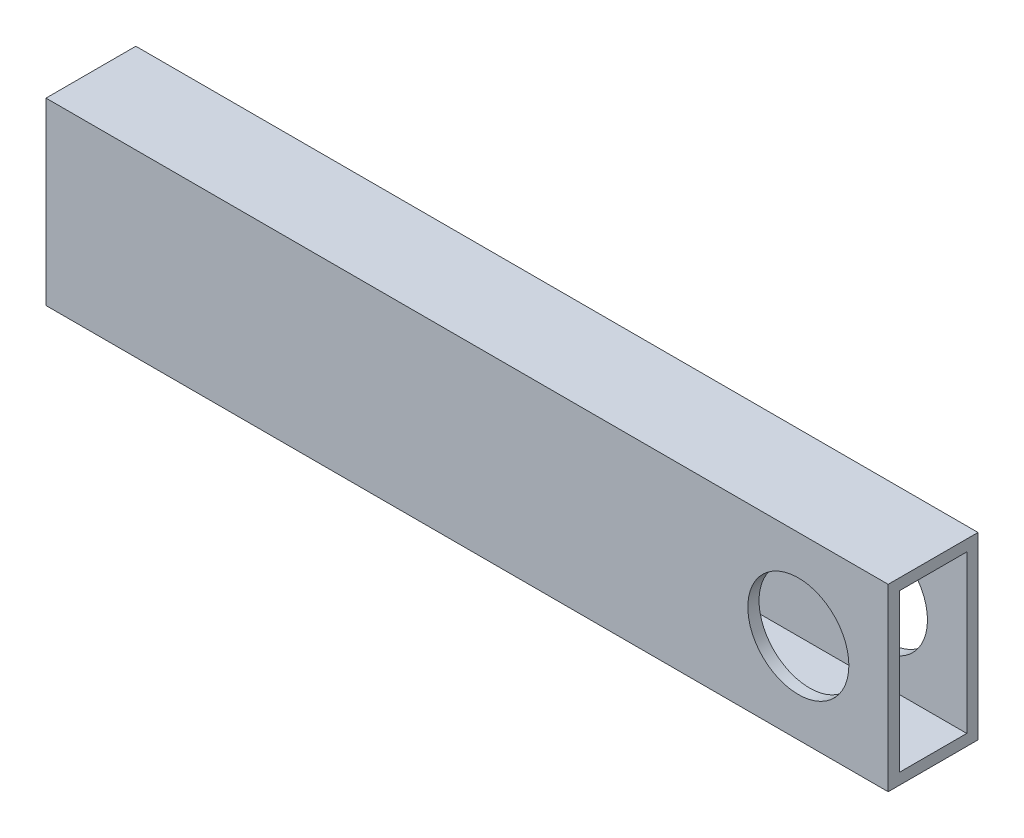
ISO-10303-21;
HEADER;
FILE_DESCRIPTION(('STEP AP214'),'2;1');
FILE_NAME('part.step','',(''),(''),'','','');
FILE_SCHEMA(('AUTOMOTIVE_DESIGN { 1 0 10303 214 1 1 1 1 }'));
ENDSEC;
DATA;
#1=APPLICATION_CONTEXT('core data for automotive mechanical design processes');
#2=APPLICATION_PROTOCOL_DEFINITION('international standard','automotive_design',2000,#1);
#3=PRODUCT_CONTEXT('',#1,'mechanical');
#4=PRODUCT('Part','Part','',(#3));
#5=PRODUCT_RELATED_PRODUCT_CATEGORY('part','',(#4));
#6=PRODUCT_DEFINITION_FORMATION('','',#4);
#7=PRODUCT_DEFINITION_CONTEXT('part definition',#1,'design');
#8=PRODUCT_DEFINITION('design','',#6,#7);
#9=PRODUCT_DEFINITION_SHAPE('','',#8);
#10=(LENGTH_UNIT() NAMED_UNIT(*) SI_UNIT(.MILLI.,.METRE.));
#11=(NAMED_UNIT(*) PLANE_ANGLE_UNIT() SI_UNIT($,.RADIAN.));
#12=(NAMED_UNIT(*) SI_UNIT($,.STERADIAN.) SOLID_ANGLE_UNIT());
#13=UNCERTAINTY_MEASURE_WITH_UNIT(LENGTH_MEASURE(1.E-05),#10,'distance_accuracy_value','');
#14=(GEOMETRIC_REPRESENTATION_CONTEXT(3) GLOBAL_UNCERTAINTY_ASSIGNED_CONTEXT((#13)) GLOBAL_UNIT_ASSIGNED_CONTEXT((#10,
#11,#12)) REPRESENTATION_CONTEXT('',''));
#15=CARTESIAN_POINT('',(0.,0.,0.));
#16=DIRECTION('',(0.,0.,1.));
#17=DIRECTION('',(1.,0.,0.));
#18=AXIS2_PLACEMENT_3D('',#15,#16,#17);
#19=CARTESIAN_POINT('',(-98.4250000000001,652.526,-25.4));
#20=DIRECTION('',(-1.,0.,0.));
#21=DIRECTION('',(0.,0.,1.));
#22=AXIS2_PLACEMENT_3D('',#19,#20,#21);
#23=PLANE('',#22);
#24=DIRECTION('',(0.,-1.,0.));
#25=VECTOR('',#24,1.);
#26=CARTESIAN_POINT('',(-98.4250000000001,652.526,0.));
#27=LINE('',#26,#25);
#28=CARTESIAN_POINT('',(-98.4250000000001,652.526,0.));
#29=VERTEX_POINT('',#28);
#30=CARTESIAN_POINT('',(-98.4250000000001,601.726,0.));
#31=VERTEX_POINT('',#30);
#32=EDGE_CURVE('E135',#29,#31,#27,.T.);
#33=ORIENTED_EDGE('',*,*,#32,.F.);
#34=DIRECTION('',(0.,0.,1.));
#35=VECTOR('',#34,1.);
#36=CARTESIAN_POINT('',(-98.4250000000001,652.526,-25.4));
#37=LINE('',#36,#35);
#38=CARTESIAN_POINT('',(-98.4250000000001,652.526,-25.4));
#39=VERTEX_POINT('',#38);
#40=EDGE_CURVE('E11',#39,#29,#37,.T.);
#41=ORIENTED_EDGE('',*,*,#40,.F.);
#42=DIRECTION('',(0.,-1.,0.));
#43=VECTOR('',#42,1.);
#44=CARTESIAN_POINT('',(-98.4250000000001,652.526,-25.4));
#45=LINE('',#44,#43);
#46=CARTESIAN_POINT('',(-98.4250000000001,601.726,-25.4));
#47=VERTEX_POINT('',#46);
#48=EDGE_CURVE('E140',#39,#47,#45,.T.);
#49=ORIENTED_EDGE('',*,*,#48,.T.);
#50=DIRECTION('',(0.,0.,1.));
#51=VECTOR('',#50,1.);
#52=CARTESIAN_POINT('',(-98.4250000000001,601.726,-25.4));
#53=LINE('',#52,#51);
#54=EDGE_CURVE('E153',#47,#31,#53,.T.);
#55=ORIENTED_EDGE('',*,*,#54,.T.);
#56=EDGE_LOOP('',(#33,#41,#49,#55));
#57=FACE_BOUND('',#56,.T.);
#58=DIRECTION('',(0.,0.,1.));
#59=VECTOR('',#58,1.);
#60=CARTESIAN_POINT('',(-98.4250000000001,649.351,-25.4));
#61=LINE('',#60,#59);
#62=CARTESIAN_POINT('',(-98.4250000000001,649.351,-22.225));
#63=VERTEX_POINT('',#62);
#64=CARTESIAN_POINT('',(-98.4250000000001,649.351,-3.175));
#65=VERTEX_POINT('',#64);
#66=EDGE_CURVE('E112',#63,#65,#61,.T.);
#67=ORIENTED_EDGE('',*,*,#66,.T.);
#68=DIRECTION('',(0.,-1.,0.));
#69=VECTOR('',#68,1.);
#70=CARTESIAN_POINT('',(-98.4250000000001,0.,-3.175));
#71=LINE('',#70,#69);
#72=CARTESIAN_POINT('',(-98.4250000000001,604.901,-3.175));
#73=VERTEX_POINT('',#72);
#74=EDGE_CURVE('E121',#65,#73,#71,.T.);
#75=ORIENTED_EDGE('',*,*,#74,.T.);
#76=DIRECTION('',(0.,0.,1.));
#77=VECTOR('',#76,1.);
#78=CARTESIAN_POINT('',(-98.4250000000001,604.901,-25.4));
#79=LINE('',#78,#77);
#80=CARTESIAN_POINT('',(-98.4250000000001,604.901,-22.225));
#81=VERTEX_POINT('',#80);
#82=EDGE_CURVE('E130',#81,#73,#79,.T.);
#83=ORIENTED_EDGE('',*,*,#82,.F.);
#84=DIRECTION('',(0.,-1.,0.));
#85=VECTOR('',#84,1.);
#86=CARTESIAN_POINT('',(-98.4250000000001,0.,-22.225));
#87=LINE('',#86,#85);
#88=EDGE_CURVE('E55',#63,#81,#87,.T.);
#89=ORIENTED_EDGE('',*,*,#88,.F.);
#90=EDGE_LOOP('',(#67,#75,#83,#89));
#91=FACE_BOUND('',#90,.T.);
#92=ADVANCED_FACE('F39',(#57,#91),#23,.T.);
#93=CARTESIAN_POINT('',(139.7,652.526,-25.4));
#94=DIRECTION('',(1.,0.,0.));
#95=DIRECTION('',(0.,0.,-1.));
#96=AXIS2_PLACEMENT_3D('',#93,#94,#95);
#97=PLANE('',#96);
#98=DIRECTION('',(0.,1.,0.));
#99=VECTOR('',#98,1.);
#100=CARTESIAN_POINT('',(139.7,652.526,0.));
#101=LINE('',#100,#99);
#102=CARTESIAN_POINT('',(139.7,601.726,0.));
#103=VERTEX_POINT('',#102);
#104=CARTESIAN_POINT('',(139.7,652.526,0.));
#105=VERTEX_POINT('',#104);
#106=EDGE_CURVE('E159',#103,#105,#101,.T.);
#107=ORIENTED_EDGE('',*,*,#106,.F.);
#108=DIRECTION('',(0.,0.,1.));
#109=VECTOR('',#108,1.);
#110=CARTESIAN_POINT('',(139.7,601.726,-25.4));
#111=LINE('',#110,#109);
#112=CARTESIAN_POINT('',(139.7,601.726,-25.4));
#113=VERTEX_POINT('',#112);
#114=EDGE_CURVE('E165',#113,#103,#111,.T.);
#115=ORIENTED_EDGE('',*,*,#114,.F.);
#116=DIRECTION('',(0.,1.,0.));
#117=VECTOR('',#116,1.);
#118=CARTESIAN_POINT('',(139.7,652.526,-25.4));
#119=LINE('',#118,#117);
#120=CARTESIAN_POINT('',(139.7,652.526,-25.4));
#121=VERTEX_POINT('',#120);
#122=EDGE_CURVE('E147',#113,#121,#119,.T.);
#123=ORIENTED_EDGE('',*,*,#122,.T.);
#124=DIRECTION('',(0.,0.,1.));
#125=VECTOR('',#124,1.);
#126=CARTESIAN_POINT('',(139.7,652.526,-25.4));
#127=LINE('',#126,#125);
#128=EDGE_CURVE('E47',#121,#105,#127,.T.);
#129=ORIENTED_EDGE('',*,*,#128,.T.);
#130=EDGE_LOOP('',(#107,#115,#123,#129));
#131=FACE_BOUND('',#130,.T.);
#132=DIRECTION('',(0.,0.,1.));
#133=VECTOR('',#132,1.);
#134=CARTESIAN_POINT('',(139.7,604.901,-25.4));
#135=LINE('',#134,#133);
#136=CARTESIAN_POINT('',(139.7,604.901,-22.225));
#137=VERTEX_POINT('',#136);
#138=CARTESIAN_POINT('',(139.7,604.901,-3.175));
#139=VERTEX_POINT('',#138);
#140=EDGE_CURVE('E113',#137,#139,#135,.T.);
#141=ORIENTED_EDGE('',*,*,#140,.T.);
#142=DIRECTION('',(0.,1.,0.));
#143=VECTOR('',#142,1.);
#144=CARTESIAN_POINT('',(139.7,0.,-3.175));
#145=LINE('',#144,#143);
#146=CARTESIAN_POINT('',(139.7,649.351,-3.175));
#147=VERTEX_POINT('',#146);
#148=EDGE_CURVE('E118',#139,#147,#145,.T.);
#149=ORIENTED_EDGE('',*,*,#148,.T.);
#150=DIRECTION('',(0.,0.,1.));
#151=VECTOR('',#150,1.);
#152=CARTESIAN_POINT('',(139.7,649.351,-25.4));
#153=LINE('',#152,#151);
#154=CARTESIAN_POINT('',(139.7,649.351,-22.225));
#155=VERTEX_POINT('',#154);
#156=EDGE_CURVE('E104',#155,#147,#153,.T.);
#157=ORIENTED_EDGE('',*,*,#156,.F.);
#158=DIRECTION('',(0.,1.,0.));
#159=VECTOR('',#158,1.);
#160=CARTESIAN_POINT('',(139.7,0.,-22.225));
#161=LINE('',#160,#159);
#162=EDGE_CURVE('E131',#137,#155,#161,.T.);
#163=ORIENTED_EDGE('',*,*,#162,.F.);
#164=EDGE_LOOP('',(#141,#149,#157,#163));
#165=FACE_BOUND('',#164,.T.);
#166=ADVANCED_FACE('F124',(#131,#165),#97,.T.);
#167=CARTESIAN_POINT('',(-98.4250000000001,652.526,-25.4));
#168=DIRECTION('',(0.,1.,0.));
#169=DIRECTION('',(0.,0.,1.));
#170=AXIS2_PLACEMENT_3D('',#167,#168,#169);
#171=PLANE('',#170);
#172=DIRECTION('',(-1.,0.,0.));
#173=VECTOR('',#172,1.);
#174=CARTESIAN_POINT('',(-98.4250000000001,652.526,0.));
#175=LINE('',#174,#173);
#176=EDGE_CURVE('E144',#105,#29,#175,.T.);
#177=ORIENTED_EDGE('',*,*,#176,.F.);
#178=ORIENTED_EDGE('',*,*,#128,.F.);
#179=DIRECTION('',(-1.,0.,0.));
#180=VECTOR('',#179,1.);
#181=CARTESIAN_POINT('',(-98.4250000000001,652.526,-25.4));
#182=LINE('',#181,#180);
#183=EDGE_CURVE('E150',#121,#39,#182,.T.);
#184=ORIENTED_EDGE('',*,*,#183,.T.);
#185=ORIENTED_EDGE('',*,*,#40,.T.);
#186=EDGE_LOOP('',(#177,#178,#184,#185));
#187=FACE_BOUND('',#186,.T.);
#188=ADVANCED_FACE('F179',(#187),#171,.T.);
#189=CARTESIAN_POINT('',(-98.4250000000001,601.726,-25.4));
#190=DIRECTION('',(0.,-1.,0.));
#191=DIRECTION('',(0.,0.,-1.));
#192=AXIS2_PLACEMENT_3D('',#189,#190,#191);
#193=PLANE('',#192);
#194=DIRECTION('',(1.,0.,0.));
#195=VECTOR('',#194,1.);
#196=CARTESIAN_POINT('',(-98.4250000000001,601.726,0.));
#197=LINE('',#196,#195);
#198=EDGE_CURVE('E156',#31,#103,#197,.T.);
#199=ORIENTED_EDGE('',*,*,#198,.F.);
#200=ORIENTED_EDGE('',*,*,#54,.F.);
#201=DIRECTION('',(1.,0.,0.));
#202=VECTOR('',#201,1.);
#203=CARTESIAN_POINT('',(-98.4250000000001,601.726,-25.4));
#204=LINE('',#203,#202);
#205=EDGE_CURVE('E143',#47,#113,#204,.T.);
#206=ORIENTED_EDGE('',*,*,#205,.T.);
#207=ORIENTED_EDGE('',*,*,#114,.T.);
#208=EDGE_LOOP('',(#199,#200,#206,#207));
#209=FACE_BOUND('',#208,.T.);
#210=ADVANCED_FACE('F173',(#209),#193,.T.);
#211=CARTESIAN_POINT('',(0.,0.,-25.4));
#212=DIRECTION('',(0.,0.,1.));
#213=DIRECTION('',(1.,0.,0.));
#214=AXIS2_PLACEMENT_3D('',#211,#212,#213);
#215=PLANE('',#214);
#216=CARTESIAN_POINT('',(114.3,627.126,-25.4));
#217=DIRECTION('',(0.,0.,1.));
#218=DIRECTION('',(1.,0.,0.));
#219=AXIS2_PLACEMENT_3D('',#216,#217,#218);
#220=CIRCLE('',#219,14.2875);
#221=CARTESIAN_POINT('',(128.5875,627.126,-25.4));
#222=VERTEX_POINT('',#221);
#223=EDGE_CURVE('E230',#222,#222,#220,.T.);
#224=ORIENTED_EDGE('',*,*,#223,.T.);
#225=EDGE_LOOP('',(#224));
#226=FACE_BOUND('',#225,.T.);
#227=ORIENTED_EDGE('',*,*,#48,.F.);
#228=ORIENTED_EDGE('',*,*,#183,.F.);
#229=ORIENTED_EDGE('',*,*,#122,.F.);
#230=ORIENTED_EDGE('',*,*,#205,.F.);
#231=EDGE_LOOP('',(#227,#228,#229,#230));
#232=FACE_BOUND('',#231,.T.);
#233=ADVANCED_FACE('F182',(#226,#232),#215,.F.);
#234=CARTESIAN_POINT('',(0.,0.,0.));
#235=DIRECTION('',(0.,0.,1.));
#236=DIRECTION('',(1.,0.,0.));
#237=AXIS2_PLACEMENT_3D('',#234,#235,#236);
#238=PLANE('',#237);
#239=CARTESIAN_POINT('',(114.3,627.126,0.));
#240=DIRECTION('',(0.,0.,1.));
#241=DIRECTION('',(1.,0.,0.));
#242=AXIS2_PLACEMENT_3D('',#239,#240,#241);
#243=CIRCLE('',#242,14.2875);
#244=CARTESIAN_POINT('',(128.5875,627.126,0.));
#245=VERTEX_POINT('',#244);
#246=EDGE_CURVE('E231',#245,#245,#243,.T.);
#247=ORIENTED_EDGE('',*,*,#246,.F.);
#248=EDGE_LOOP('',(#247));
#249=FACE_BOUND('',#248,.T.);
#250=ORIENTED_EDGE('',*,*,#32,.T.);
#251=ORIENTED_EDGE('',*,*,#198,.T.);
#252=ORIENTED_EDGE('',*,*,#106,.T.);
#253=ORIENTED_EDGE('',*,*,#176,.T.);
#254=EDGE_LOOP('',(#250,#251,#252,#253));
#255=FACE_BOUND('',#254,.T.);
#256=ADVANCED_FACE('F176',(#249,#255),#238,.T.);
#257=CARTESIAN_POINT('',(-98.4250000000001,649.351,-25.4));
#258=DIRECTION('',(0.,1.,0.));
#259=DIRECTION('',(0.,0.,1.));
#260=AXIS2_PLACEMENT_3D('',#257,#258,#259);
#261=PLANE('',#260);
#262=DIRECTION('',(-1.,0.,0.));
#263=VECTOR('',#262,1.);
#264=CARTESIAN_POINT('',(0.,649.351,-3.175));
#265=LINE('',#264,#263);
#266=EDGE_CURVE('E107',#147,#65,#265,.T.);
#267=ORIENTED_EDGE('',*,*,#266,.T.);
#268=ORIENTED_EDGE('',*,*,#66,.F.);
#269=DIRECTION('',(-1.,0.,0.));
#270=VECTOR('',#269,1.);
#271=CARTESIAN_POINT('',(0.,649.351,-22.225));
#272=LINE('',#271,#270);
#273=EDGE_CURVE('E62',#155,#63,#272,.T.);
#274=ORIENTED_EDGE('',*,*,#273,.F.);
#275=ORIENTED_EDGE('',*,*,#156,.T.);
#276=EDGE_LOOP('',(#267,#268,#274,#275));
#277=FACE_BOUND('',#276,.T.);
#278=ADVANCED_FACE('F106',(#277),#261,.F.);
#279=CARTESIAN_POINT('',(-98.4250000000001,604.901,-25.4));
#280=DIRECTION('',(0.,-1.,0.));
#281=DIRECTION('',(0.,0.,-1.));
#282=AXIS2_PLACEMENT_3D('',#279,#280,#281);
#283=PLANE('',#282);
#284=DIRECTION('',(1.,0.,0.));
#285=VECTOR('',#284,1.);
#286=CARTESIAN_POINT('',(0.,604.901,-3.175));
#287=LINE('',#286,#285);
#288=EDGE_CURVE('E125',#73,#139,#287,.T.);
#289=ORIENTED_EDGE('',*,*,#288,.T.);
#290=ORIENTED_EDGE('',*,*,#140,.F.);
#291=DIRECTION('',(1.,0.,0.));
#292=VECTOR('',#291,1.);
#293=CARTESIAN_POINT('',(0.,604.901,-22.225));
#294=LINE('',#293,#292);
#295=EDGE_CURVE('E133',#81,#137,#294,.T.);
#296=ORIENTED_EDGE('',*,*,#295,.F.);
#297=ORIENTED_EDGE('',*,*,#82,.T.);
#298=EDGE_LOOP('',(#289,#290,#296,#297));
#299=FACE_BOUND('',#298,.T.);
#300=ADVANCED_FACE('F214',(#299),#283,.F.);
#301=CARTESIAN_POINT('',(0.,0.,-22.225));
#302=DIRECTION('',(0.,0.,1.));
#303=DIRECTION('',(1.,0.,0.));
#304=AXIS2_PLACEMENT_3D('',#301,#302,#303);
#305=PLANE('',#304);
#306=CARTESIAN_POINT('',(114.3,627.126,-22.225));
#307=DIRECTION('',(0.,0.,1.));
#308=DIRECTION('',(1.,0.,0.));
#309=AXIS2_PLACEMENT_3D('',#306,#307,#308);
#310=CIRCLE('',#309,14.2875);
#311=CARTESIAN_POINT('',(128.5875,627.126,-22.225));
#312=VERTEX_POINT('',#311);
#313=EDGE_CURVE('E139',#312,#312,#310,.T.);
#314=ORIENTED_EDGE('',*,*,#313,.F.);
#315=EDGE_LOOP('',(#314));
#316=FACE_BOUND('',#315,.T.);
#317=ORIENTED_EDGE('',*,*,#88,.T.);
#318=ORIENTED_EDGE('',*,*,#295,.T.);
#319=ORIENTED_EDGE('',*,*,#162,.T.);
#320=ORIENTED_EDGE('',*,*,#273,.T.);
#321=EDGE_LOOP('',(#317,#318,#319,#320));
#322=FACE_BOUND('',#321,.T.);
#323=ADVANCED_FACE('F210',(#316,#322),#305,.T.);
#324=CARTESIAN_POINT('',(0.,0.,-3.175));
#325=DIRECTION('',(0.,0.,1.));
#326=DIRECTION('',(1.,0.,0.));
#327=AXIS2_PLACEMENT_3D('',#324,#325,#326);
#328=PLANE('',#327);
#329=CARTESIAN_POINT('',(114.3,627.126,-3.175));
#330=DIRECTION('',(0.,0.,1.));
#331=DIRECTION('',(1.,0.,0.));
#332=AXIS2_PLACEMENT_3D('',#329,#330,#331);
#333=CIRCLE('',#332,14.2875);
#334=CARTESIAN_POINT('',(128.5875,627.126,-3.175));
#335=VERTEX_POINT('',#334);
#336=EDGE_CURVE('E42',#335,#335,#333,.T.);
#337=ORIENTED_EDGE('',*,*,#336,.T.);
#338=EDGE_LOOP('',(#337));
#339=FACE_BOUND('',#338,.T.);
#340=ORIENTED_EDGE('',*,*,#74,.F.);
#341=ORIENTED_EDGE('',*,*,#266,.F.);
#342=ORIENTED_EDGE('',*,*,#148,.F.);
#343=ORIENTED_EDGE('',*,*,#288,.F.);
#344=EDGE_LOOP('',(#340,#341,#342,#343));
#345=FACE_BOUND('',#344,.T.);
#346=ADVANCED_FACE('F116',(#339,#345),#328,.F.);
#347=CARTESIAN_POINT('',(114.3,627.126,-25.4));
#348=DIRECTION('',(0.,0.,1.));
#349=DIRECTION('',(1.,0.,0.));
#350=AXIS2_PLACEMENT_3D('',#347,#348,#349);
#351=CYLINDRICAL_SURFACE('',#350,14.2875);
#352=ORIENTED_EDGE('',*,*,#246,.T.);
#353=EDGE_LOOP('',(#352));
#354=FACE_BOUND('',#353,.T.);
#355=ORIENTED_EDGE('',*,*,#336,.F.);
#356=EDGE_LOOP('',(#355));
#357=FACE_BOUND('',#356,.T.);
#358=ADVANCED_FACE('F209',(#354,#357),#351,.F.);
#359=ORIENTED_EDGE('',*,*,#313,.T.);
#360=EDGE_LOOP('',(#359));
#361=FACE_BOUND('',#360,.T.);
#362=ORIENTED_EDGE('',*,*,#223,.F.);
#363=EDGE_LOOP('',(#362));
#364=FACE_BOUND('',#363,.T.);
#365=ADVANCED_FACE('F219',(#361,#364),#351,.F.);
#366=CLOSED_SHELL('',(#92,#166,#188,#210,#233,#256,#278,#300,#323,#346,#358,#365));
#367=MANIFOLD_SOLID_BREP('B2',#366);
#368=ADVANCED_BREP_SHAPE_REPRESENTATION('',(#18,#367),#14);
#369=SHAPE_DEFINITION_REPRESENTATION(#9,#368);
ENDSEC;
END-ISO-10303-21;
